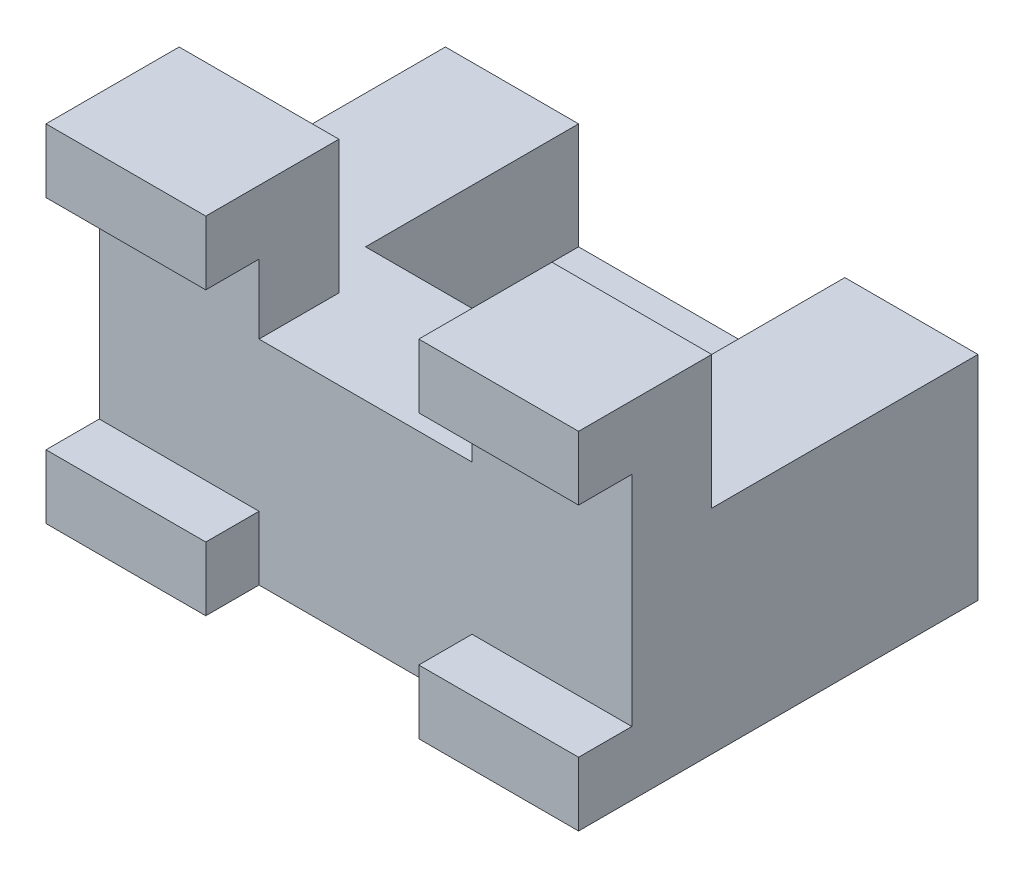
ISO-10303-21;
HEADER;
FILE_DESCRIPTION(('STEP AP214'),'2;1');
FILE_NAME('part.step','',(''),(''),'','','');
FILE_SCHEMA(('AUTOMOTIVE_DESIGN { 1 0 10303 214 1 1 1 1 }'));
ENDSEC;
DATA;
#1=APPLICATION_CONTEXT('core data for automotive mechanical design processes');
#2=APPLICATION_PROTOCOL_DEFINITION('international standard','automotive_design',2000,#1);
#3=PRODUCT_CONTEXT('',#1,'mechanical');
#4=PRODUCT('Part','Part','',(#3));
#5=PRODUCT_RELATED_PRODUCT_CATEGORY('part','',(#4));
#6=PRODUCT_DEFINITION_FORMATION('','',#4);
#7=PRODUCT_DEFINITION_CONTEXT('part definition',#1,'design');
#8=PRODUCT_DEFINITION('design','',#6,#7);
#9=PRODUCT_DEFINITION_SHAPE('','',#8);
#10=(LENGTH_UNIT() NAMED_UNIT(*) SI_UNIT(.MILLI.,.METRE.));
#11=(NAMED_UNIT(*) PLANE_ANGLE_UNIT() SI_UNIT($,.RADIAN.));
#12=(NAMED_UNIT(*) SI_UNIT($,.STERADIAN.) SOLID_ANGLE_UNIT());
#13=UNCERTAINTY_MEASURE_WITH_UNIT(LENGTH_MEASURE(1.E-05),#10,'distance_accuracy_value','');
#14=(GEOMETRIC_REPRESENTATION_CONTEXT(3) GLOBAL_UNCERTAINTY_ASSIGNED_CONTEXT((#13)) GLOBAL_UNIT_ASSIGNED_CONTEXT((#10,
#11,#12)) REPRESENTATION_CONTEXT('',''));
#15=CARTESIAN_POINT('',(0.,0.,0.));
#16=DIRECTION('',(0.,0.,1.));
#17=DIRECTION('',(1.,0.,0.));
#18=AXIS2_PLACEMENT_3D('',#15,#16,#17);
#19=CARTESIAN_POINT('',(0.,40.,0.));
#20=DIRECTION('',(-1.,0.,0.));
#21=DIRECTION('',(0.,0.,1.));
#22=AXIS2_PLACEMENT_3D('',#19,#20,#21);
#23=PLANE('',#22);
#24=DIRECTION('',(0.,-1.,0.));
#25=VECTOR('',#24,1.);
#26=CARTESIAN_POINT('',(0.,0.,-10.));
#27=LINE('',#26,#25);
#28=CARTESIAN_POINT('',(0.,53.,-9.99999999999999));
#29=VERTEX_POINT('',#28);
#30=CARTESIAN_POINT('',(0.,12.,-10.));
#31=VERTEX_POINT('',#30);
#32=EDGE_CURVE('E226',#29,#31,#27,.T.);
#33=ORIENTED_EDGE('',*,*,#32,.F.);
#34=DIRECTION('',(0.,0.,-1.));
#35=VECTOR('',#34,1.);
#36=CARTESIAN_POINT('',(0.,53.,0.));
#37=LINE('',#36,#35);
#38=CARTESIAN_POINT('',(0.,53.,0.));
#39=VERTEX_POINT('',#38);
#40=EDGE_CURVE('E210',#39,#29,#37,.T.);
#41=ORIENTED_EDGE('',*,*,#40,.F.);
#42=DIRECTION('',(0.,-1.,0.));
#43=VECTOR('',#42,1.);
#44=CARTESIAN_POINT('',(0.,65.,0.));
#45=LINE('',#44,#43);
#46=CARTESIAN_POINT('',(0.,65.,0.));
#47=VERTEX_POINT('',#46);
#48=EDGE_CURVE('E224',#47,#39,#45,.T.);
#49=ORIENTED_EDGE('',*,*,#48,.F.);
#50=DIRECTION('',(0.,0.,-1.));
#51=VECTOR('',#50,1.);
#52=CARTESIAN_POINT('',(0.,65.,0.));
#53=LINE('',#52,#51);
#54=CARTESIAN_POINT('',(0.,65.,-25.));
#55=VERTEX_POINT('',#54);
#56=EDGE_CURVE('E243',#47,#55,#53,.T.);
#57=ORIENTED_EDGE('',*,*,#56,.T.);
#58=DIRECTION('',(0.,-1.,0.));
#59=VECTOR('',#58,1.);
#60=CARTESIAN_POINT('',(0.,65.,-25.));
#61=LINE('',#60,#59);
#62=CARTESIAN_POINT('',(0.,40.,-25.));
#63=VERTEX_POINT('',#62);
#64=EDGE_CURVE('E235',#55,#63,#61,.T.);
#65=ORIENTED_EDGE('',*,*,#64,.T.);
#66=DIRECTION('',(0.,0.,-1.));
#67=VECTOR('',#66,1.);
#68=CARTESIAN_POINT('',(0.,40.,0.));
#69=LINE('',#68,#67);
#70=CARTESIAN_POINT('',(0.,40.,-75.));
#71=VERTEX_POINT('',#70);
#72=EDGE_CURVE('E328',#63,#71,#69,.T.);
#73=ORIENTED_EDGE('',*,*,#72,.T.);
#74=DIRECTION('',(0.,-1.,0.));
#75=VECTOR('',#74,1.);
#76=CARTESIAN_POINT('',(0.,40.,-75.));
#77=LINE('',#76,#75);
#78=CARTESIAN_POINT('',(0.,0.,-75.));
#79=VERTEX_POINT('',#78);
#80=EDGE_CURVE('E381',#71,#79,#77,.T.);
#81=ORIENTED_EDGE('',*,*,#80,.T.);
#82=DIRECTION('',(0.,0.,-1.));
#83=VECTOR('',#82,1.);
#84=CARTESIAN_POINT('',(0.,0.,0.));
#85=LINE('',#84,#83);
#86=CARTESIAN_POINT('',(0.,0.,0.));
#87=VERTEX_POINT('',#86);
#88=EDGE_CURVE('E310',#87,#79,#85,.T.);
#89=ORIENTED_EDGE('',*,*,#88,.F.);
#90=CARTESIAN_POINT('',(0.,12.,0.));
#91=VERTEX_POINT('',#90);
#92=EDGE_CURVE('E236',#91,#87,#45,.T.);
#93=ORIENTED_EDGE('',*,*,#92,.F.);
#94=DIRECTION('',(0.,0.,1.));
#95=VECTOR('',#94,1.);
#96=CARTESIAN_POINT('',(0.,12.,0.));
#97=LINE('',#96,#95);
#98=EDGE_CURVE('E69',#31,#91,#97,.T.);
#99=ORIENTED_EDGE('',*,*,#98,.F.);
#100=EDGE_LOOP('',(#33,#41,#49,#57,#65,#73,#81,#89,#93,#99));
#101=FACE_BOUND('',#100,.T.);
#102=ADVANCED_FACE('F45',(#101),#23,.T.);
#103=CARTESIAN_POINT('',(100.,40.,0.));
#104=DIRECTION('',(1.,0.,0.));
#105=DIRECTION('',(0.,0.,-1.));
#106=AXIS2_PLACEMENT_3D('',#103,#104,#105);
#107=PLANE('',#106);
#108=DIRECTION('',(0.,-1.,0.));
#109=VECTOR('',#108,1.);
#110=CARTESIAN_POINT('',(100.,65.,0.));
#111=LINE('',#110,#109);
#112=CARTESIAN_POINT('',(100.,65.,0.));
#113=VERTEX_POINT('',#112);
#114=CARTESIAN_POINT('',(100.,53.,0.));
#115=VERTEX_POINT('',#114);
#116=EDGE_CURVE('E284',#113,#115,#111,.T.);
#117=ORIENTED_EDGE('',*,*,#116,.T.);
#118=DIRECTION('',(0.,0.,-1.));
#119=VECTOR('',#118,1.);
#120=CARTESIAN_POINT('',(100.,53.,0.));
#121=LINE('',#120,#119);
#122=CARTESIAN_POINT('',(100.,53.,-9.99999999999999));
#123=VERTEX_POINT('',#122);
#124=EDGE_CURVE('E478',#115,#123,#121,.T.);
#125=ORIENTED_EDGE('',*,*,#124,.T.);
#126=DIRECTION('',(0.,-1.,0.));
#127=VECTOR('',#126,1.);
#128=CARTESIAN_POINT('',(100.,0.,-10.));
#129=LINE('',#128,#127);
#130=CARTESIAN_POINT('',(100.,12.,-10.));
#131=VERTEX_POINT('',#130);
#132=EDGE_CURVE('E228',#123,#131,#129,.T.);
#133=ORIENTED_EDGE('',*,*,#132,.T.);
#134=DIRECTION('',(0.,0.,1.));
#135=VECTOR('',#134,1.);
#136=CARTESIAN_POINT('',(100.,12.,0.));
#137=LINE('',#136,#135);
#138=CARTESIAN_POINT('',(100.,12.,0.));
#139=VERTEX_POINT('',#138);
#140=EDGE_CURVE('E474',#131,#139,#137,.T.);
#141=ORIENTED_EDGE('',*,*,#140,.T.);
#142=CARTESIAN_POINT('',(100.,0.,0.));
#143=VERTEX_POINT('',#142);
#144=EDGE_CURVE('E283',#139,#143,#111,.T.);
#145=ORIENTED_EDGE('',*,*,#144,.T.);
#146=DIRECTION('',(0.,0.,1.));
#147=VECTOR('',#146,1.);
#148=CARTESIAN_POINT('',(100.,0.,0.));
#149=LINE('',#148,#147);
#150=CARTESIAN_POINT('',(100.,0.,-75.));
#151=VERTEX_POINT('',#150);
#152=EDGE_CURVE('E357',#151,#143,#149,.T.);
#153=ORIENTED_EDGE('',*,*,#152,.F.);
#154=DIRECTION('',(0.,-1.,0.));
#155=VECTOR('',#154,1.);
#156=CARTESIAN_POINT('',(100.,40.,-75.));
#157=LINE('',#156,#155);
#158=CARTESIAN_POINT('',(100.,40.,-75.));
#159=VERTEX_POINT('',#158);
#160=EDGE_CURVE('E372',#159,#151,#157,.T.);
#161=ORIENTED_EDGE('',*,*,#160,.F.);
#162=DIRECTION('',(0.,0.,1.));
#163=VECTOR('',#162,1.);
#164=CARTESIAN_POINT('',(100.,40.,0.));
#165=LINE('',#164,#163);
#166=CARTESIAN_POINT('',(100.,40.,-25.));
#167=VERTEX_POINT('',#166);
#168=EDGE_CURVE('E350',#159,#167,#165,.T.);
#169=ORIENTED_EDGE('',*,*,#168,.T.);
#170=DIRECTION('',(0.,-1.,0.));
#171=VECTOR('',#170,1.);
#172=CARTESIAN_POINT('',(100.,65.,-25.));
#173=LINE('',#172,#171);
#174=CARTESIAN_POINT('',(100.,65.,-25.));
#175=VERTEX_POINT('',#174);
#176=EDGE_CURVE('E273',#175,#167,#173,.T.);
#177=ORIENTED_EDGE('',*,*,#176,.F.);
#178=DIRECTION('',(0.,0.,1.));
#179=VECTOR('',#178,1.);
#180=CARTESIAN_POINT('',(100.,65.,0.));
#181=LINE('',#180,#179);
#182=EDGE_CURVE('E269',#175,#113,#181,.T.);
#183=ORIENTED_EDGE('',*,*,#182,.T.);
#184=EDGE_LOOP('',(#117,#125,#133,#141,#145,#153,#161,#169,#177,#183));
#185=FACE_BOUND('',#184,.T.);
#186=ADVANCED_FACE('F500',(#185),#107,.T.);
#187=CARTESIAN_POINT('',(70.,65.,0.));
#188=DIRECTION('',(-1.,0.,0.));
#189=DIRECTION('',(0.,0.,1.));
#190=AXIS2_PLACEMENT_3D('',#187,#188,#189);
#191=PLANE('',#190);
#192=DIRECTION('',(0.,1.,0.));
#193=VECTOR('',#192,1.);
#194=CARTESIAN_POINT('',(70.,65.,-9.99999999999999));
#195=LINE('',#194,#193);
#196=CARTESIAN_POINT('',(70.,40.,-10.));
#197=VERTEX_POINT('',#196);
#198=CARTESIAN_POINT('',(70.,53.,-9.99999999999999));
#199=VERTEX_POINT('',#198);
#200=EDGE_CURVE('E432',#197,#199,#195,.T.);
#201=ORIENTED_EDGE('',*,*,#200,.T.);
#202=DIRECTION('',(0.,0.,1.));
#203=VECTOR('',#202,1.);
#204=CARTESIAN_POINT('',(70.,53.,0.));
#205=LINE('',#204,#203);
#206=CARTESIAN_POINT('',(70.,53.,0.));
#207=VERTEX_POINT('',#206);
#208=EDGE_CURVE('E435',#199,#207,#205,.T.);
#209=ORIENTED_EDGE('',*,*,#208,.T.);
#210=DIRECTION('',(0.,-1.,0.));
#211=VECTOR('',#210,1.);
#212=CARTESIAN_POINT('',(70.,65.,0.));
#213=LINE('',#212,#211);
#214=CARTESIAN_POINT('',(70.,65.,0.));
#215=VERTEX_POINT('',#214);
#216=EDGE_CURVE('E289',#215,#207,#213,.T.);
#217=ORIENTED_EDGE('',*,*,#216,.F.);
#218=DIRECTION('',(0.,0.,-1.));
#219=VECTOR('',#218,1.);
#220=CARTESIAN_POINT('',(70.,65.,0.));
#221=LINE('',#220,#219);
#222=CARTESIAN_POINT('',(70.,65.,-25.));
#223=VERTEX_POINT('',#222);
#224=EDGE_CURVE('E260',#215,#223,#221,.T.);
#225=ORIENTED_EDGE('',*,*,#224,.T.);
#226=DIRECTION('',(0.,-1.,0.));
#227=VECTOR('',#226,1.);
#228=CARTESIAN_POINT('',(70.,65.,-25.));
#229=LINE('',#228,#227);
#230=CARTESIAN_POINT('',(70.,40.,-25.));
#231=VERTEX_POINT('',#230);
#232=EDGE_CURVE('E293',#223,#231,#229,.T.);
#233=ORIENTED_EDGE('',*,*,#232,.T.);
#234=DIRECTION('',(0.,0.,-1.));
#235=VECTOR('',#234,1.);
#236=CARTESIAN_POINT('',(70.,40.,0.));
#237=LINE('',#236,#235);
#238=EDGE_CURVE('E344',#197,#231,#237,.T.);
#239=ORIENTED_EDGE('',*,*,#238,.F.);
#240=EDGE_LOOP('',(#201,#209,#217,#225,#233,#239));
#241=FACE_BOUND('',#240,.T.);
#242=ADVANCED_FACE('F510',(#241),#191,.T.);
#243=CARTESIAN_POINT('',(70.,12.,0.));
#244=VERTEX_POINT('',#243);
#245=CARTESIAN_POINT('',(70.,0.,0.));
#246=VERTEX_POINT('',#245);
#247=EDGE_CURVE('E288',#244,#246,#213,.T.);
#248=ORIENTED_EDGE('',*,*,#247,.F.);
#249=DIRECTION('',(0.,0.,-1.));
#250=VECTOR('',#249,1.);
#251=CARTESIAN_POINT('',(70.,12.,0.));
#252=LINE('',#251,#250);
#253=CARTESIAN_POINT('',(70.,12.,-10.));
#254=VERTEX_POINT('',#253);
#255=EDGE_CURVE('E61',#244,#254,#252,.T.);
#256=ORIENTED_EDGE('',*,*,#255,.T.);
#257=DIRECTION('',(0.,-1.,0.));
#258=VECTOR('',#257,1.);
#259=CARTESIAN_POINT('',(70.,40.,-10.));
#260=LINE('',#259,#258);
#261=CARTESIAN_POINT('',(70.,0.,-10.));
#262=VERTEX_POINT('',#261);
#263=EDGE_CURVE('E375',#254,#262,#260,.T.);
#264=ORIENTED_EDGE('',*,*,#263,.T.);
#265=DIRECTION('',(0.,0.,-1.));
#266=VECTOR('',#265,1.);
#267=CARTESIAN_POINT('',(70.,0.,0.));
#268=LINE('',#267,#266);
#269=EDGE_CURVE('E255',#246,#262,#268,.T.);
#270=ORIENTED_EDGE('',*,*,#269,.F.);
#271=EDGE_LOOP('',(#248,#256,#264,#270));
#272=FACE_BOUND('',#271,.T.);
#273=ADVANCED_FACE('F533',(#272),#191,.T.);
#274=CARTESIAN_POINT('',(0.,65.,0.));
#275=DIRECTION('',(0.,0.,1.));
#276=DIRECTION('',(1.,0.,0.));
#277=AXIS2_PLACEMENT_3D('',#274,#275,#276);
#278=PLANE('',#277);
#279=ORIENTED_EDGE('',*,*,#216,.T.);
#280=DIRECTION('',(1.,0.,0.));
#281=VECTOR('',#280,1.);
#282=CARTESIAN_POINT('',(0.,53.,0.));
#283=LINE('',#282,#281);
#284=EDGE_CURVE('E219',#207,#115,#283,.T.);
#285=ORIENTED_EDGE('',*,*,#284,.T.);
#286=ORIENTED_EDGE('',*,*,#116,.F.);
#287=DIRECTION('',(-1.,0.,0.));
#288=VECTOR('',#287,1.);
#289=CARTESIAN_POINT('',(0.,65.,0.));
#290=LINE('',#289,#288);
#291=EDGE_CURVE('E265',#113,#215,#290,.T.);
#292=ORIENTED_EDGE('',*,*,#291,.T.);
#293=EDGE_LOOP('',(#279,#285,#286,#292));
#294=FACE_BOUND('',#293,.T.);
#295=ADVANCED_FACE('F504',(#294),#278,.T.);
#296=ORIENTED_EDGE('',*,*,#144,.F.);
#297=DIRECTION('',(1.,0.,0.));
#298=VECTOR('',#297,1.);
#299=CARTESIAN_POINT('',(0.,12.,0.));
#300=LINE('',#299,#298);
#301=EDGE_CURVE('E218',#244,#139,#300,.T.);
#302=ORIENTED_EDGE('',*,*,#301,.F.);
#303=ORIENTED_EDGE('',*,*,#247,.T.);
#304=DIRECTION('',(-1.,0.,0.));
#305=VECTOR('',#304,1.);
#306=CARTESIAN_POINT('',(0.,0.,0.));
#307=LINE('',#306,#305);
#308=EDGE_CURVE('E261',#143,#246,#307,.T.);
#309=ORIENTED_EDGE('',*,*,#308,.F.);
#310=EDGE_LOOP('',(#296,#302,#303,#309));
#311=FACE_BOUND('',#310,.T.);
#312=ADVANCED_FACE('F529',(#311),#278,.T.);
#313=CARTESIAN_POINT('',(30.,65.,0.));
#314=DIRECTION('',(1.,0.,0.));
#315=DIRECTION('',(0.,0.,-1.));
#316=AXIS2_PLACEMENT_3D('',#313,#314,#315);
#317=PLANE('',#316);
#318=DIRECTION('',(0.,-1.,0.));
#319=VECTOR('',#318,1.);
#320=CARTESIAN_POINT('',(30.,65.,0.));
#321=LINE('',#320,#319);
#322=CARTESIAN_POINT('',(30.,65.,0.));
#323=VERTEX_POINT('',#322);
#324=CARTESIAN_POINT('',(30.,53.,0.));
#325=VERTEX_POINT('',#324);
#326=EDGE_CURVE('E252',#323,#325,#321,.T.);
#327=ORIENTED_EDGE('',*,*,#326,.T.);
#328=DIRECTION('',(0.,0.,-1.));
#329=VECTOR('',#328,1.);
#330=CARTESIAN_POINT('',(30.,53.,0.));
#331=LINE('',#330,#329);
#332=CARTESIAN_POINT('',(30.,53.,-9.99999999999999));
#333=VERTEX_POINT('',#332);
#334=EDGE_CURVE('E213',#325,#333,#331,.T.);
#335=ORIENTED_EDGE('',*,*,#334,.T.);
#336=DIRECTION('',(0.,-1.,0.));
#337=VECTOR('',#336,1.);
#338=CARTESIAN_POINT('',(30.,65.,-9.99999999999999));
#339=LINE('',#338,#337);
#340=CARTESIAN_POINT('',(30.,40.,-10.));
#341=VERTEX_POINT('',#340);
#342=EDGE_CURVE('E11',#333,#341,#339,.T.);
#343=ORIENTED_EDGE('',*,*,#342,.T.);
#344=DIRECTION('',(0.,0.,1.));
#345=VECTOR('',#344,1.);
#346=CARTESIAN_POINT('',(30.,40.,0.));
#347=LINE('',#346,#345);
#348=CARTESIAN_POINT('',(30.,40.,-25.));
#349=VERTEX_POINT('',#348);
#350=EDGE_CURVE('E336',#349,#341,#347,.T.);
#351=ORIENTED_EDGE('',*,*,#350,.F.);
#352=DIRECTION('',(0.,-1.,0.));
#353=VECTOR('',#352,1.);
#354=CARTESIAN_POINT('',(30.,65.,-25.));
#355=LINE('',#354,#353);
#356=CARTESIAN_POINT('',(30.,65.,-25.));
#357=VERTEX_POINT('',#356);
#358=EDGE_CURVE('E241',#357,#349,#355,.T.);
#359=ORIENTED_EDGE('',*,*,#358,.F.);
#360=DIRECTION('',(0.,0.,1.));
#361=VECTOR('',#360,1.);
#362=CARTESIAN_POINT('',(30.,65.,0.));
#363=LINE('',#362,#361);
#364=EDGE_CURVE('E444',#357,#323,#363,.T.);
#365=ORIENTED_EDGE('',*,*,#364,.T.);
#366=EDGE_LOOP('',(#327,#335,#343,#351,#359,#365));
#367=FACE_BOUND('',#366,.T.);
#368=ADVANCED_FACE('F516',(#367),#317,.T.);
#369=DIRECTION('',(0.,-1.,0.));
#370=VECTOR('',#369,1.);
#371=CARTESIAN_POINT('',(30.,40.,-10.));
#372=LINE('',#371,#370);
#373=CARTESIAN_POINT('',(30.,12.,-10.));
#374=VERTEX_POINT('',#373);
#375=CARTESIAN_POINT('',(30.,0.,-10.));
#376=VERTEX_POINT('',#375);
#377=EDGE_CURVE('E378',#374,#376,#372,.T.);
#378=ORIENTED_EDGE('',*,*,#377,.F.);
#379=DIRECTION('',(0.,0.,1.));
#380=VECTOR('',#379,1.);
#381=CARTESIAN_POINT('',(30.,12.,0.));
#382=LINE('',#381,#380);
#383=CARTESIAN_POINT('',(30.,12.,0.));
#384=VERTEX_POINT('',#383);
#385=EDGE_CURVE('E419',#374,#384,#382,.T.);
#386=ORIENTED_EDGE('',*,*,#385,.T.);
#387=CARTESIAN_POINT('',(30.,0.,0.));
#388=VERTEX_POINT('',#387);
#389=EDGE_CURVE('E251',#384,#388,#321,.T.);
#390=ORIENTED_EDGE('',*,*,#389,.T.);
#391=DIRECTION('',(0.,0.,1.));
#392=VECTOR('',#391,1.);
#393=CARTESIAN_POINT('',(30.,0.,0.));
#394=LINE('',#393,#392);
#395=EDGE_CURVE('E245',#376,#388,#394,.T.);
#396=ORIENTED_EDGE('',*,*,#395,.F.);
#397=EDGE_LOOP('',(#378,#386,#390,#396));
#398=FACE_BOUND('',#397,.T.);
#399=ADVANCED_FACE('F418',(#398),#317,.T.);
#400=CARTESIAN_POINT('',(0.,65.,0.));
#401=DIRECTION('',(0.,0.,1.));
#402=DIRECTION('',(1.,0.,0.));
#403=AXIS2_PLACEMENT_3D('',#400,#401,#402);
#404=PLANE('',#403);
#405=ORIENTED_EDGE('',*,*,#48,.T.);
#406=EDGE_CURVE('E206',#39,#325,#283,.T.);
#407=ORIENTED_EDGE('',*,*,#406,.T.);
#408=ORIENTED_EDGE('',*,*,#326,.F.);
#409=DIRECTION('',(-1.,0.,0.));
#410=VECTOR('',#409,1.);
#411=CARTESIAN_POINT('',(0.,65.,0.));
#412=LINE('',#411,#410);
#413=EDGE_CURVE('E232',#323,#47,#412,.T.);
#414=ORIENTED_EDGE('',*,*,#413,.T.);
#415=EDGE_LOOP('',(#405,#407,#408,#414));
#416=FACE_BOUND('',#415,.T.);
#417=ADVANCED_FACE('F230',(#416),#404,.T.);
#418=ORIENTED_EDGE('',*,*,#389,.F.);
#419=EDGE_CURVE('E460',#91,#384,#300,.T.);
#420=ORIENTED_EDGE('',*,*,#419,.F.);
#421=ORIENTED_EDGE('',*,*,#92,.T.);
#422=DIRECTION('',(-1.,0.,0.));
#423=VECTOR('',#422,1.);
#424=CARTESIAN_POINT('',(0.,0.,0.));
#425=LINE('',#424,#423);
#426=EDGE_CURVE('E426',#388,#87,#425,.T.);
#427=ORIENTED_EDGE('',*,*,#426,.F.);
#428=EDGE_LOOP('',(#418,#420,#421,#427));
#429=FACE_BOUND('',#428,.T.);
#430=ADVANCED_FACE('F428',(#429),#404,.T.);
#431=CARTESIAN_POINT('',(75.,40.,0.));
#432=DIRECTION('',(-1.,0.,0.));
#433=DIRECTION('',(0.,0.,1.));
#434=AXIS2_PLACEMENT_3D('',#431,#432,#433);
#435=PLANE('',#434);
#436=DIRECTION('',(0.,0.,-1.));
#437=VECTOR('',#436,1.);
#438=CARTESIAN_POINT('',(75.,20.,0.));
#439=LINE('',#438,#437);
#440=CARTESIAN_POINT('',(75.,20.,-35.));
#441=VERTEX_POINT('',#440);
#442=CARTESIAN_POINT('',(75.,20.,-75.));
#443=VERTEX_POINT('',#442);
#444=EDGE_CURVE('E300',#441,#443,#439,.T.);
#445=ORIENTED_EDGE('',*,*,#444,.F.);
#446=DIRECTION('',(0.,-1.,0.));
#447=VECTOR('',#446,1.);
#448=CARTESIAN_POINT('',(75.,40.,-35.));
#449=LINE('',#448,#447);
#450=CARTESIAN_POINT('',(75.,40.,-35.));
#451=VERTEX_POINT('',#450);
#452=EDGE_CURVE('E54',#451,#441,#449,.T.);
#453=ORIENTED_EDGE('',*,*,#452,.F.);
#454=DIRECTION('',(0.,0.,-1.));
#455=VECTOR('',#454,1.);
#456=CARTESIAN_POINT('',(75.,40.,0.));
#457=LINE('',#456,#455);
#458=CARTESIAN_POINT('',(75.,40.,-75.));
#459=VERTEX_POINT('',#458);
#460=EDGE_CURVE('E311',#451,#459,#457,.T.);
#461=ORIENTED_EDGE('',*,*,#460,.T.);
#462=DIRECTION('',(0.,-1.,0.));
#463=VECTOR('',#462,1.);
#464=CARTESIAN_POINT('',(75.,40.,-75.));
#465=LINE('',#464,#463);
#466=EDGE_CURVE('E368',#459,#443,#465,.T.);
#467=ORIENTED_EDGE('',*,*,#466,.T.);
#468=EDGE_LOOP('',(#445,#453,#461,#467));
#469=FACE_BOUND('',#468,.T.);
#470=ADVANCED_FACE('F47',(#469),#435,.T.);
#471=CARTESIAN_POINT('',(0.,40.,-35.));
#472=DIRECTION('',(0.,0.,-1.));
#473=DIRECTION('',(-1.,0.,0.));
#474=AXIS2_PLACEMENT_3D('',#471,#472,#473);
#475=PLANE('',#474);
#476=DIRECTION('',(1.,0.,0.));
#477=VECTOR('',#476,1.);
#478=CARTESIAN_POINT('',(0.,20.,-35.));
#479=LINE('',#478,#477);
#480=CARTESIAN_POINT('',(25.,20.,-35.));
#481=VERTEX_POINT('',#480);
#482=EDGE_CURVE('E297',#481,#441,#479,.T.);
#483=ORIENTED_EDGE('',*,*,#482,.F.);
#484=DIRECTION('',(0.,-1.,0.));
#485=VECTOR('',#484,1.);
#486=CARTESIAN_POINT('',(25.,40.,-35.));
#487=LINE('',#486,#485);
#488=CARTESIAN_POINT('',(25.,40.,-35.));
#489=VERTEX_POINT('',#488);
#490=EDGE_CURVE('E389',#489,#481,#487,.T.);
#491=ORIENTED_EDGE('',*,*,#490,.F.);
#492=DIRECTION('',(1.,0.,0.));
#493=VECTOR('',#492,1.);
#494=CARTESIAN_POINT('',(0.,40.,-35.));
#495=LINE('',#494,#493);
#496=EDGE_CURVE('E315',#489,#451,#495,.T.);
#497=ORIENTED_EDGE('',*,*,#496,.T.);
#498=ORIENTED_EDGE('',*,*,#452,.T.);
#499=EDGE_LOOP('',(#483,#491,#497,#498));
#500=FACE_BOUND('',#499,.T.);
#501=ADVANCED_FACE('F396',(#500),#475,.T.);
#502=CARTESIAN_POINT('',(25.,40.,0.));
#503=DIRECTION('',(1.,0.,0.));
#504=DIRECTION('',(0.,0.,-1.));
#505=AXIS2_PLACEMENT_3D('',#502,#503,#504);
#506=PLANE('',#505);
#507=DIRECTION('',(0.,0.,1.));
#508=VECTOR('',#507,1.);
#509=CARTESIAN_POINT('',(25.,20.,0.));
#510=LINE('',#509,#508);
#511=CARTESIAN_POINT('',(25.,20.,-75.));
#512=VERTEX_POINT('',#511);
#513=EDGE_CURVE('E307',#512,#481,#510,.T.);
#514=ORIENTED_EDGE('',*,*,#513,.F.);
#515=DIRECTION('',(0.,-1.,0.));
#516=VECTOR('',#515,1.);
#517=CARTESIAN_POINT('',(25.,40.,-75.));
#518=LINE('',#517,#516);
#519=CARTESIAN_POINT('',(25.,40.,-75.));
#520=VERTEX_POINT('',#519);
#521=EDGE_CURVE('E385',#520,#512,#518,.T.);
#522=ORIENTED_EDGE('',*,*,#521,.F.);
#523=DIRECTION('',(0.,0.,1.));
#524=VECTOR('',#523,1.);
#525=CARTESIAN_POINT('',(25.,40.,0.));
#526=LINE('',#525,#524);
#527=EDGE_CURVE('E320',#520,#489,#526,.T.);
#528=ORIENTED_EDGE('',*,*,#527,.T.);
#529=ORIENTED_EDGE('',*,*,#490,.T.);
#530=EDGE_LOOP('',(#514,#522,#528,#529));
#531=FACE_BOUND('',#530,.T.);
#532=ADVANCED_FACE('F553',(#531),#506,.T.);
#533=CARTESIAN_POINT('',(0.,40.,-10.));
#534=DIRECTION('',(0.,0.,-1.));
#535=DIRECTION('',(-1.,0.,0.));
#536=AXIS2_PLACEMENT_3D('',#533,#534,#535);
#537=PLANE('',#536);
#538=DIRECTION('',(1.,0.,0.));
#539=VECTOR('',#538,1.);
#540=CARTESIAN_POINT('',(0.,40.,-10.));
#541=LINE('',#540,#539);
#542=EDGE_CURVE('E340',#341,#197,#541,.T.);
#543=ORIENTED_EDGE('',*,*,#542,.F.);
#544=ORIENTED_EDGE('',*,*,#342,.F.);
#545=DIRECTION('',(1.,0.,0.));
#546=VECTOR('',#545,1.);
#547=CARTESIAN_POINT('',(0.,53.,-9.99999999999999));
#548=LINE('',#547,#546);
#549=EDGE_CURVE('E458',#29,#333,#548,.T.);
#550=ORIENTED_EDGE('',*,*,#549,.F.);
#551=ORIENTED_EDGE('',*,*,#32,.T.);
#552=DIRECTION('',(1.,0.,0.));
#553=VECTOR('',#552,1.);
#554=CARTESIAN_POINT('',(0.,12.,-10.));
#555=LINE('',#554,#553);
#556=EDGE_CURVE('E464',#31,#374,#555,.T.);
#557=ORIENTED_EDGE('',*,*,#556,.T.);
#558=ORIENTED_EDGE('',*,*,#377,.T.);
#559=DIRECTION('',(1.,0.,0.));
#560=VECTOR('',#559,1.);
#561=CARTESIAN_POINT('',(0.,0.,-10.));
#562=LINE('',#561,#560);
#563=EDGE_CURVE('E361',#376,#262,#562,.T.);
#564=ORIENTED_EDGE('',*,*,#563,.T.);
#565=ORIENTED_EDGE('',*,*,#263,.F.);
#566=EDGE_CURVE('E463',#254,#131,#555,.T.);
#567=ORIENTED_EDGE('',*,*,#566,.T.);
#568=ORIENTED_EDGE('',*,*,#132,.F.);
#569=EDGE_CURVE('E468',#199,#123,#548,.T.);
#570=ORIENTED_EDGE('',*,*,#569,.F.);
#571=ORIENTED_EDGE('',*,*,#200,.F.);
#572=EDGE_LOOP('',(#543,#544,#550,#551,#557,#558,#564,#565,#567,#568,#570,#571));
#573=FACE_BOUND('',#572,.T.);
#574=ADVANCED_FACE('F496',(#573),#537,.F.);
#575=CARTESIAN_POINT('',(0.,40.,-75.));
#576=DIRECTION('',(0.,0.,-1.));
#577=DIRECTION('',(-1.,0.,0.));
#578=AXIS2_PLACEMENT_3D('',#575,#576,#577);
#579=PLANE('',#578);
#580=DIRECTION('',(1.,0.,0.));
#581=VECTOR('',#580,1.);
#582=CARTESIAN_POINT('',(0.,0.,-75.));
#583=LINE('',#582,#581);
#584=EDGE_CURVE('E316',#79,#151,#583,.T.);
#585=ORIENTED_EDGE('',*,*,#584,.F.);
#586=ORIENTED_EDGE('',*,*,#80,.F.);
#587=DIRECTION('',(1.,0.,0.));
#588=VECTOR('',#587,1.);
#589=CARTESIAN_POINT('',(0.,40.,-75.));
#590=LINE('',#589,#588);
#591=EDGE_CURVE('E324',#71,#520,#590,.T.);
#592=ORIENTED_EDGE('',*,*,#591,.T.);
#593=ORIENTED_EDGE('',*,*,#521,.T.);
#594=DIRECTION('',(1.,0.,0.));
#595=VECTOR('',#594,1.);
#596=CARTESIAN_POINT('',(0.,20.,-75.));
#597=LINE('',#596,#595);
#598=EDGE_CURVE('E303',#512,#443,#597,.T.);
#599=ORIENTED_EDGE('',*,*,#598,.T.);
#600=ORIENTED_EDGE('',*,*,#466,.F.);
#601=EDGE_CURVE('E329',#459,#159,#590,.T.);
#602=ORIENTED_EDGE('',*,*,#601,.T.);
#603=ORIENTED_EDGE('',*,*,#160,.T.);
#604=EDGE_LOOP('',(#585,#586,#592,#593,#599,#600,#602,#603));
#605=FACE_BOUND('',#604,.T.);
#606=ADVANCED_FACE('F524',(#605),#579,.T.);
#607=CARTESIAN_POINT('',(0.,40.,0.));
#608=DIRECTION('',(0.,1.,0.));
#609=DIRECTION('',(0.,0.,1.));
#610=AXIS2_PLACEMENT_3D('',#607,#608,#609);
#611=PLANE('',#610);
#612=ORIENTED_EDGE('',*,*,#460,.F.);
#613=ORIENTED_EDGE('',*,*,#496,.F.);
#614=ORIENTED_EDGE('',*,*,#527,.F.);
#615=ORIENTED_EDGE('',*,*,#591,.F.);
#616=ORIENTED_EDGE('',*,*,#72,.F.);
#617=DIRECTION('',(1.,0.,0.));
#618=VECTOR('',#617,1.);
#619=CARTESIAN_POINT('',(0.,40.,-25.));
#620=LINE('',#619,#618);
#621=EDGE_CURVE('E333',#63,#349,#620,.T.);
#622=ORIENTED_EDGE('',*,*,#621,.T.);
#623=ORIENTED_EDGE('',*,*,#350,.T.);
#624=ORIENTED_EDGE('',*,*,#542,.T.);
#625=ORIENTED_EDGE('',*,*,#238,.T.);
#626=DIRECTION('',(1.,0.,0.));
#627=VECTOR('',#626,1.);
#628=CARTESIAN_POINT('',(0.,40.,-25.));
#629=LINE('',#628,#627);
#630=EDGE_CURVE('E347',#231,#167,#629,.T.);
#631=ORIENTED_EDGE('',*,*,#630,.T.);
#632=ORIENTED_EDGE('',*,*,#168,.F.);
#633=ORIENTED_EDGE('',*,*,#601,.F.);
#634=EDGE_LOOP('',(#612,#613,#614,#615,#616,#622,#623,#624,#625,#631,#632,#633));
#635=FACE_BOUND('',#634,.T.);
#636=ADVANCED_FACE('F403',(#635),#611,.T.);
#637=CARTESIAN_POINT('',(0.,0.,0.));
#638=DIRECTION('',(0.,1.,0.));
#639=DIRECTION('',(0.,0.,1.));
#640=AXIS2_PLACEMENT_3D('',#637,#638,#639);
#641=PLANE('',#640);
#642=ORIENTED_EDGE('',*,*,#563,.F.);
#643=ORIENTED_EDGE('',*,*,#395,.T.);
#644=ORIENTED_EDGE('',*,*,#426,.T.);
#645=ORIENTED_EDGE('',*,*,#88,.T.);
#646=ORIENTED_EDGE('',*,*,#584,.T.);
#647=ORIENTED_EDGE('',*,*,#152,.T.);
#648=ORIENTED_EDGE('',*,*,#308,.T.);
#649=ORIENTED_EDGE('',*,*,#269,.T.);
#650=EDGE_LOOP('',(#642,#643,#644,#645,#646,#647,#648,#649));
#651=FACE_BOUND('',#650,.T.);
#652=ADVANCED_FACE('F425',(#651),#641,.F.);
#653=CARTESIAN_POINT('',(0.,20.,0.));
#654=DIRECTION('',(0.,1.,0.));
#655=DIRECTION('',(0.,0.,1.));
#656=AXIS2_PLACEMENT_3D('',#653,#654,#655);
#657=PLANE('',#656);
#658=ORIENTED_EDGE('',*,*,#482,.T.);
#659=ORIENTED_EDGE('',*,*,#444,.T.);
#660=ORIENTED_EDGE('',*,*,#598,.F.);
#661=ORIENTED_EDGE('',*,*,#513,.T.);
#662=EDGE_LOOP('',(#658,#659,#660,#661));
#663=FACE_BOUND('',#662,.T.);
#664=ADVANCED_FACE('F579',(#663),#657,.T.);
#665=CARTESIAN_POINT('',(0.,65.,-25.));
#666=DIRECTION('',(0.,0.,-1.));
#667=DIRECTION('',(-1.,0.,0.));
#668=AXIS2_PLACEMENT_3D('',#665,#666,#667);
#669=PLANE('',#668);
#670=ORIENTED_EDGE('',*,*,#176,.T.);
#671=ORIENTED_EDGE('',*,*,#630,.F.);
#672=ORIENTED_EDGE('',*,*,#232,.F.);
#673=DIRECTION('',(1.,0.,0.));
#674=VECTOR('',#673,1.);
#675=CARTESIAN_POINT('',(0.,65.,-25.));
#676=LINE('',#675,#674);
#677=EDGE_CURVE('E256',#223,#175,#676,.T.);
#678=ORIENTED_EDGE('',*,*,#677,.T.);
#679=EDGE_LOOP('',(#670,#671,#672,#678));
#680=FACE_BOUND('',#679,.T.);
#681=ADVANCED_FACE('F572',(#680),#669,.T.);
#682=CARTESIAN_POINT('',(0.,65.,0.));
#683=DIRECTION('',(0.,1.,0.));
#684=DIRECTION('',(0.,0.,1.));
#685=AXIS2_PLACEMENT_3D('',#682,#683,#684);
#686=PLANE('',#685);
#687=ORIENTED_EDGE('',*,*,#677,.F.);
#688=ORIENTED_EDGE('',*,*,#224,.F.);
#689=ORIENTED_EDGE('',*,*,#291,.F.);
#690=ORIENTED_EDGE('',*,*,#182,.F.);
#691=EDGE_LOOP('',(#687,#688,#689,#690));
#692=FACE_BOUND('',#691,.T.);
#693=ADVANCED_FACE('F508',(#692),#686,.T.);
#694=CARTESIAN_POINT('',(0.,65.,-25.));
#695=DIRECTION('',(0.,0.,-1.));
#696=DIRECTION('',(-1.,0.,0.));
#697=AXIS2_PLACEMENT_3D('',#694,#695,#696);
#698=PLANE('',#697);
#699=ORIENTED_EDGE('',*,*,#358,.T.);
#700=ORIENTED_EDGE('',*,*,#621,.F.);
#701=ORIENTED_EDGE('',*,*,#64,.F.);
#702=DIRECTION('',(1.,0.,0.));
#703=VECTOR('',#702,1.);
#704=CARTESIAN_POINT('',(0.,65.,-25.));
#705=LINE('',#704,#703);
#706=EDGE_CURVE('E440',#55,#357,#705,.T.);
#707=ORIENTED_EDGE('',*,*,#706,.T.);
#708=EDGE_LOOP('',(#699,#700,#701,#707));
#709=FACE_BOUND('',#708,.T.);
#710=ADVANCED_FACE('F519',(#709),#698,.T.);
#711=CARTESIAN_POINT('',(0.,65.,0.));
#712=DIRECTION('',(0.,1.,0.));
#713=DIRECTION('',(0.,0.,1.));
#714=AXIS2_PLACEMENT_3D('',#711,#712,#713);
#715=PLANE('',#714);
#716=ORIENTED_EDGE('',*,*,#413,.F.);
#717=ORIENTED_EDGE('',*,*,#364,.F.);
#718=ORIENTED_EDGE('',*,*,#706,.F.);
#719=ORIENTED_EDGE('',*,*,#56,.F.);
#720=EDGE_LOOP('',(#716,#717,#718,#719));
#721=FACE_BOUND('',#720,.T.);
#722=ADVANCED_FACE('F522',(#721),#715,.T.);
#723=CARTESIAN_POINT('',(0.,12.,0.));
#724=DIRECTION('',(0.,1.,0.));
#725=DIRECTION('',(0.,0.,1.));
#726=AXIS2_PLACEMENT_3D('',#723,#724,#725);
#727=PLANE('',#726);
#728=ORIENTED_EDGE('',*,*,#556,.F.);
#729=ORIENTED_EDGE('',*,*,#98,.T.);
#730=ORIENTED_EDGE('',*,*,#419,.T.);
#731=ORIENTED_EDGE('',*,*,#385,.F.);
#732=EDGE_LOOP('',(#728,#729,#730,#731));
#733=FACE_BOUND('',#732,.T.);
#734=ADVANCED_FACE('F534',(#733),#727,.T.);
#735=CARTESIAN_POINT('',(0.,53.,0.));
#736=DIRECTION('',(0.,-1.,0.));
#737=DIRECTION('',(0.,0.,-1.));
#738=AXIS2_PLACEMENT_3D('',#735,#736,#737);
#739=PLANE('',#738);
#740=ORIENTED_EDGE('',*,*,#406,.F.);
#741=ORIENTED_EDGE('',*,*,#40,.T.);
#742=ORIENTED_EDGE('',*,*,#549,.T.);
#743=ORIENTED_EDGE('',*,*,#334,.F.);
#744=EDGE_LOOP('',(#740,#741,#742,#743));
#745=FACE_BOUND('',#744,.T.);
#746=ADVANCED_FACE('F208',(#745),#739,.T.);
#747=ORIENTED_EDGE('',*,*,#569,.T.);
#748=ORIENTED_EDGE('',*,*,#124,.F.);
#749=ORIENTED_EDGE('',*,*,#284,.F.);
#750=ORIENTED_EDGE('',*,*,#208,.F.);
#751=EDGE_LOOP('',(#747,#748,#749,#750));
#752=FACE_BOUND('',#751,.T.);
#753=ADVANCED_FACE('F493',(#752),#739,.T.);
#754=ORIENTED_EDGE('',*,*,#301,.T.);
#755=ORIENTED_EDGE('',*,*,#140,.F.);
#756=ORIENTED_EDGE('',*,*,#566,.F.);
#757=ORIENTED_EDGE('',*,*,#255,.F.);
#758=EDGE_LOOP('',(#754,#755,#756,#757));
#759=FACE_BOUND('',#758,.T.);
#760=ADVANCED_FACE('F537',(#759),#727,.T.);
#761=CLOSED_SHELL('',(#102,#186,#242,#273,#295,#312,#368,#399,#417,#430,#470,#501,#532,#574,
#606,#636,#652,#664,#681,#693,#710,#722,#734,#746,#753,#760));
#762=MANIFOLD_SOLID_BREP('B2',#761);
#763=ADVANCED_BREP_SHAPE_REPRESENTATION('',(#18,#762),#14);
#764=SHAPE_DEFINITION_REPRESENTATION(#9,#763);
ENDSEC;
END-ISO-10303-21;
